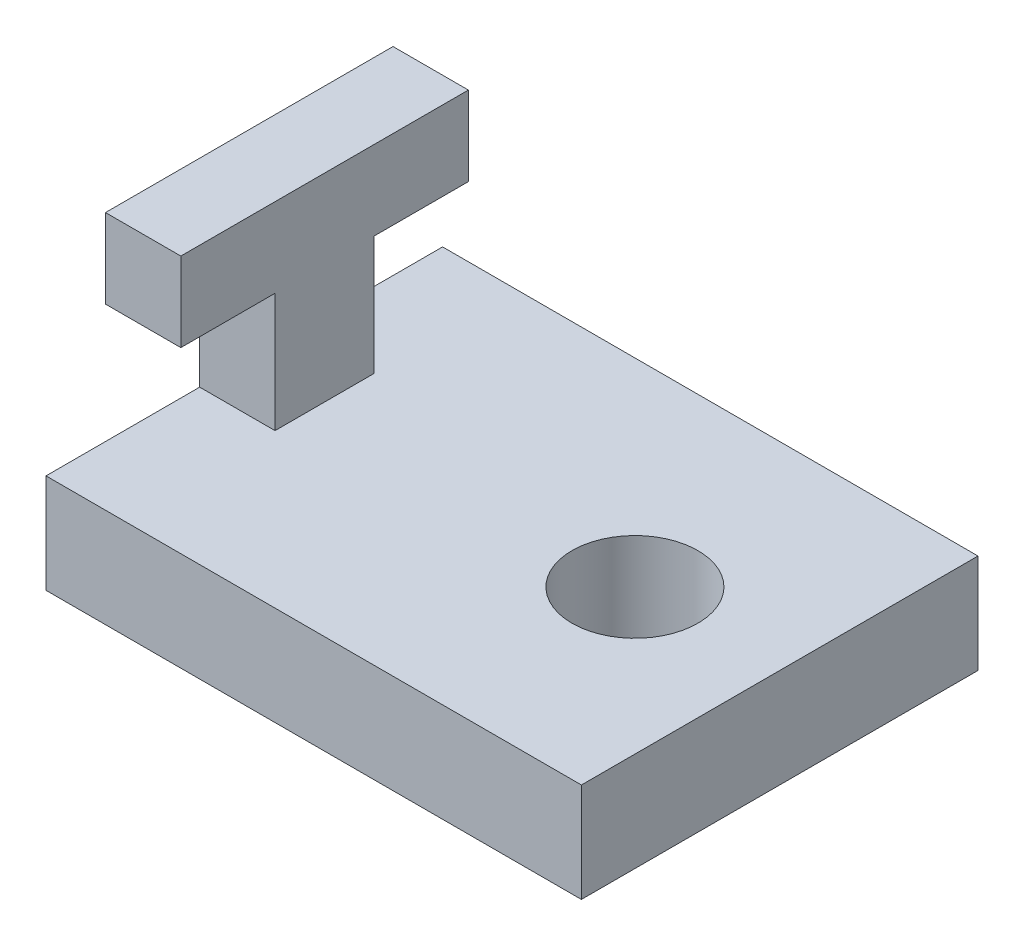
ISO-10303-21;
HEADER;
FILE_DESCRIPTION(('STEP AP214'),'2;1');
FILE_NAME('part.step','',(''),(''),'','','');
FILE_SCHEMA(('AUTOMOTIVE_DESIGN { 1 0 10303 214 1 1 1 1 }'));
ENDSEC;
DATA;
#1=APPLICATION_CONTEXT('core data for automotive mechanical design processes');
#2=APPLICATION_PROTOCOL_DEFINITION('international standard','automotive_design',2000,#1);
#3=PRODUCT_CONTEXT('',#1,'mechanical');
#4=PRODUCT('Part','Part','',(#3));
#5=PRODUCT_RELATED_PRODUCT_CATEGORY('part','',(#4));
#6=PRODUCT_DEFINITION_FORMATION('','',#4);
#7=PRODUCT_DEFINITION_CONTEXT('part definition',#1,'design');
#8=PRODUCT_DEFINITION('design','',#6,#7);
#9=PRODUCT_DEFINITION_SHAPE('','',#8);
#10=(LENGTH_UNIT() NAMED_UNIT(*) SI_UNIT(.MILLI.,.METRE.));
#11=(NAMED_UNIT(*) PLANE_ANGLE_UNIT() SI_UNIT($,.RADIAN.));
#12=(NAMED_UNIT(*) SI_UNIT($,.STERADIAN.) SOLID_ANGLE_UNIT());
#13=UNCERTAINTY_MEASURE_WITH_UNIT(LENGTH_MEASURE(1.E-05),#10,'distance_accuracy_value','');
#14=(GEOMETRIC_REPRESENTATION_CONTEXT(3) GLOBAL_UNCERTAINTY_ASSIGNED_CONTEXT((#13)) GLOBAL_UNIT_ASSIGNED_CONTEXT((#10,
#11,#12)) REPRESENTATION_CONTEXT('',''));
#15=CARTESIAN_POINT('',(0.,0.,0.));
#16=DIRECTION('',(0.,0.,1.));
#17=DIRECTION('',(1.,0.,0.));
#18=AXIS2_PLACEMENT_3D('',#15,#16,#17);
#19=CARTESIAN_POINT('',(96.52,381.,-323.85));
#20=DIRECTION('',(0.,0.,1.));
#21=DIRECTION('',(1.,0.,0.));
#22=AXIS2_PLACEMENT_3D('',#19,#20,#21);
#23=PLANE('',#22);
#24=DIRECTION('',(-1.,0.,0.));
#25=VECTOR('',#24,1.);
#26=CARTESIAN_POINT('',(96.52,279.4,-323.85));
#27=LINE('',#26,#25);
#28=CARTESIAN_POINT('',(96.52,279.4,-323.85));
#29=VERTEX_POINT('',#28);
#30=CARTESIAN_POINT('',(0.,279.4,-323.85));
#31=VERTEX_POINT('',#30);
#32=EDGE_CURVE('E153',#29,#31,#27,.T.);
#33=ORIENTED_EDGE('',*,*,#32,.F.);
#34=DIRECTION('',(0.,-1.,0.));
#35=VECTOR('',#34,1.);
#36=CARTESIAN_POINT('',(96.52,381.,-323.85));
#37=LINE('',#36,#35);
#38=CARTESIAN_POINT('',(96.52,127.,-323.85));
#39=VERTEX_POINT('',#38);
#40=EDGE_CURVE('E157',#29,#39,#37,.T.);
#41=ORIENTED_EDGE('',*,*,#40,.T.);
#42=DIRECTION('',(-1.,0.,0.));
#43=VECTOR('',#42,1.);
#44=CARTESIAN_POINT('',(96.52,127.,-323.85));
#45=LINE('',#44,#43);
#46=CARTESIAN_POINT('',(0.,127.,-323.85));
#47=VERTEX_POINT('',#46);
#48=EDGE_CURVE('E193',#39,#47,#45,.T.);
#49=ORIENTED_EDGE('',*,*,#48,.T.);
#50=DIRECTION('',(0.,-1.,0.));
#51=VECTOR('',#50,1.);
#52=CARTESIAN_POINT('',(0.,381.,-323.85));
#53=LINE('',#52,#51);
#54=EDGE_CURVE('E206',#31,#47,#53,.T.);
#55=ORIENTED_EDGE('',*,*,#54,.F.);
#56=EDGE_LOOP('',(#33,#41,#49,#55));
#57=FACE_BOUND('',#56,.T.);
#58=ADVANCED_FACE('F39',(#57),#23,.F.);
#59=CARTESIAN_POINT('',(-1.35129474703731E-13,381.,-196.85));
#60=DIRECTION('',(0.,0.,-1.));
#61=DIRECTION('',(-1.,0.,0.));
#62=AXIS2_PLACEMENT_3D('',#59,#60,#61);
#63=PLANE('',#62);
#64=DIRECTION('',(1.,0.,0.));
#65=VECTOR('',#64,1.);
#66=CARTESIAN_POINT('',(0.,279.4,-196.85));
#67=LINE('',#66,#65);
#68=CARTESIAN_POINT('',(0.,279.4,-196.85));
#69=VERTEX_POINT('',#68);
#70=CARTESIAN_POINT('',(96.52,279.4,-196.85));
#71=VERTEX_POINT('',#70);
#72=EDGE_CURVE('E159',#69,#71,#67,.T.);
#73=ORIENTED_EDGE('',*,*,#72,.F.);
#74=DIRECTION('',(0.,-1.,0.));
#75=VECTOR('',#74,1.);
#76=CARTESIAN_POINT('',(-1.35129474703731E-13,381.,-196.85));
#77=LINE('',#76,#75);
#78=CARTESIAN_POINT('',(0.,127.,-196.85));
#79=VERTEX_POINT('',#78);
#80=EDGE_CURVE('E63',#69,#79,#77,.T.);
#81=ORIENTED_EDGE('',*,*,#80,.T.);
#82=DIRECTION('',(1.,0.,0.));
#83=VECTOR('',#82,1.);
#84=CARTESIAN_POINT('',(-1.35129474703731E-13,127.,-196.85));
#85=LINE('',#84,#83);
#86=CARTESIAN_POINT('',(96.52,127.,-196.85));
#87=VERTEX_POINT('',#86);
#88=EDGE_CURVE('E188',#79,#87,#85,.T.);
#89=ORIENTED_EDGE('',*,*,#88,.T.);
#90=DIRECTION('',(0.,-1.,0.));
#91=VECTOR('',#90,1.);
#92=CARTESIAN_POINT('',(96.52,381.,-196.85));
#93=LINE('',#92,#91);
#94=EDGE_CURVE('E55',#71,#87,#93,.T.);
#95=ORIENTED_EDGE('',*,*,#94,.F.);
#96=EDGE_LOOP('',(#73,#81,#89,#95));
#97=FACE_BOUND('',#96,.T.);
#98=ADVANCED_FACE('F291',(#97),#63,.F.);
#99=CARTESIAN_POINT('',(0.,127.,0.));
#100=DIRECTION('',(0.,-1.,0.));
#101=DIRECTION('',(0.,0.,-1.));
#102=AXIS2_PLACEMENT_3D('',#99,#100,#101);
#103=PLANE('',#102);
#104=CARTESIAN_POINT('',(500.38,127.,-254.));
#105=DIRECTION('',(0.,1.,0.));
#106=DIRECTION('',(0.,0.,1.));
#107=AXIS2_PLACEMENT_3D('',#104,#105,#106);
#108=CIRCLE('',#107,80.645);
#109=CARTESIAN_POINT('',(500.38,127.,-173.355));
#110=VERTEX_POINT('',#109);
#111=EDGE_CURVE('E277',#110,#110,#108,.T.);
#112=ORIENTED_EDGE('',*,*,#111,.F.);
#113=EDGE_LOOP('',(#112));
#114=FACE_BOUND('',#113,.T.);
#115=ORIENTED_EDGE('',*,*,#88,.F.);
#116=DIRECTION('',(0.,0.,1.));
#117=VECTOR('',#116,1.);
#118=CARTESIAN_POINT('',(0.,127.,0.));
#119=LINE('',#118,#117);
#120=CARTESIAN_POINT('',(0.,127.,0.));
#121=VERTEX_POINT('',#120);
#122=EDGE_CURVE('E219',#79,#121,#119,.T.);
#123=ORIENTED_EDGE('',*,*,#122,.T.);
#124=DIRECTION('',(1.,0.,0.));
#125=VECTOR('',#124,1.);
#126=CARTESIAN_POINT('',(0.,127.,0.));
#127=LINE('',#126,#125);
#128=CARTESIAN_POINT('',(685.8,127.,0.));
#129=VERTEX_POINT('',#128);
#130=EDGE_CURVE('E218',#121,#129,#127,.T.);
#131=ORIENTED_EDGE('',*,*,#130,.T.);
#132=DIRECTION('',(0.,0.,-1.));
#133=VECTOR('',#132,1.);
#134=CARTESIAN_POINT('',(685.8,127.,0.));
#135=LINE('',#134,#133);
#136=CARTESIAN_POINT('',(685.8,127.,-508.));
#137=VERTEX_POINT('',#136);
#138=EDGE_CURVE('E222',#129,#137,#135,.T.);
#139=ORIENTED_EDGE('',*,*,#138,.T.);
#140=DIRECTION('',(-1.,0.,0.));
#141=VECTOR('',#140,1.);
#142=CARTESIAN_POINT('',(-1.11022302462516E-13,127.,-508.));
#143=LINE('',#142,#141);
#144=CARTESIAN_POINT('',(-1.11022302462516E-13,127.,-508.));
#145=VERTEX_POINT('',#144);
#146=EDGE_CURVE('E225',#137,#145,#143,.T.);
#147=ORIENTED_EDGE('',*,*,#146,.T.);
#148=EDGE_CURVE('E214',#145,#47,#119,.T.);
#149=ORIENTED_EDGE('',*,*,#148,.T.);
#150=ORIENTED_EDGE('',*,*,#48,.F.);
#151=DIRECTION('',(0.,0.,-1.));
#152=VECTOR('',#151,1.);
#153=CARTESIAN_POINT('',(96.52,127.,-323.85));
#154=LINE('',#153,#152);
#155=EDGE_CURVE('E198',#87,#39,#154,.T.);
#156=ORIENTED_EDGE('',*,*,#155,.F.);
#157=EDGE_LOOP('',(#115,#123,#131,#139,#147,#149,#150,#156));
#158=FACE_BOUND('',#157,.T.);
#159=ADVANCED_FACE('F271',(#114,#158),#103,.F.);
#160=CARTESIAN_POINT('',(0.,127.,0.));
#161=DIRECTION('',(1.,0.,0.));
#162=DIRECTION('',(0.,0.,-1.));
#163=AXIS2_PLACEMENT_3D('',#160,#161,#162);
#164=PLANE('',#163);
#165=DIRECTION('',(0.,0.,1.));
#166=VECTOR('',#165,1.);
#167=CARTESIAN_POINT('',(0.,0.,0.));
#168=LINE('',#167,#166);
#169=CARTESIAN_POINT('',(-1.11022302462516E-13,0.,-508.));
#170=VERTEX_POINT('',#169);
#171=CARTESIAN_POINT('',(0.,0.,0.));
#172=VERTEX_POINT('',#171);
#173=EDGE_CURVE('E213',#170,#172,#168,.T.);
#174=ORIENTED_EDGE('',*,*,#173,.T.);
#175=DIRECTION('',(0.,-1.,0.));
#176=VECTOR('',#175,1.);
#177=CARTESIAN_POINT('',(0.,127.,0.));
#178=LINE('',#177,#176);
#179=EDGE_CURVE('E11',#121,#172,#178,.T.);
#180=ORIENTED_EDGE('',*,*,#179,.F.);
#181=ORIENTED_EDGE('',*,*,#122,.F.);
#182=ORIENTED_EDGE('',*,*,#80,.F.);
#183=DIRECTION('',(0.,0.,-1.));
#184=VECTOR('',#183,1.);
#185=CARTESIAN_POINT('',(0.,279.4,-76.2));
#186=LINE('',#185,#184);
#187=CARTESIAN_POINT('',(0.,279.4,-76.2));
#188=VERTEX_POINT('',#187);
#189=EDGE_CURVE('E185',#188,#69,#186,.T.);
#190=ORIENTED_EDGE('',*,*,#189,.F.);
#191=DIRECTION('',(0.,-1.,0.));
#192=VECTOR('',#191,1.);
#193=CARTESIAN_POINT('',(-1.35129474703731E-13,381.,-76.2));
#194=LINE('',#193,#192);
#195=CARTESIAN_POINT('',(-1.35129474703731E-13,381.,-76.2));
#196=VERTEX_POINT('',#195);
#197=EDGE_CURVE('E163',#196,#188,#194,.T.);
#198=ORIENTED_EDGE('',*,*,#197,.F.);
#199=DIRECTION('',(0.,0.,1.));
#200=VECTOR('',#199,1.);
#201=CARTESIAN_POINT('',(0.,381.,-323.85));
#202=LINE('',#201,#200);
#203=CARTESIAN_POINT('',(0.,381.,-444.5));
#204=VERTEX_POINT('',#203);
#205=EDGE_CURVE('E192',#204,#196,#202,.T.);
#206=ORIENTED_EDGE('',*,*,#205,.F.);
#207=DIRECTION('',(0.,1.,0.));
#208=VECTOR('',#207,1.);
#209=CARTESIAN_POINT('',(0.,381.,-444.5));
#210=LINE('',#209,#208);
#211=CARTESIAN_POINT('',(0.,279.4,-444.5));
#212=VERTEX_POINT('',#211);
#213=EDGE_CURVE('E144',#212,#204,#210,.T.);
#214=ORIENTED_EDGE('',*,*,#213,.F.);
#215=DIRECTION('',(0.,0.,1.));
#216=VECTOR('',#215,1.);
#217=CARTESIAN_POINT('',(0.,279.4,-444.5));
#218=LINE('',#217,#216);
#219=EDGE_CURVE('E139',#212,#31,#218,.T.);
#220=ORIENTED_EDGE('',*,*,#219,.T.);
#221=ORIENTED_EDGE('',*,*,#54,.T.);
#222=ORIENTED_EDGE('',*,*,#148,.F.);
#223=DIRECTION('',(0.,-1.,0.));
#224=VECTOR('',#223,1.);
#225=CARTESIAN_POINT('',(-1.11022302462516E-13,127.,-508.));
#226=LINE('',#225,#224);
#227=EDGE_CURVE('E228',#145,#170,#226,.T.);
#228=ORIENTED_EDGE('',*,*,#227,.T.);
#229=EDGE_LOOP('',(#174,#180,#181,#182,#190,#198,#206,#214,#220,#221,#222,#228));
#230=FACE_BOUND('',#229,.T.);
#231=ADVANCED_FACE('F41',(#230),#164,.F.);
#232=CARTESIAN_POINT('',(0.,127.,0.));
#233=DIRECTION('',(0.,0.,-1.));
#234=DIRECTION('',(-1.,0.,0.));
#235=AXIS2_PLACEMENT_3D('',#232,#233,#234);
#236=PLANE('',#235);
#237=DIRECTION('',(1.,0.,0.));
#238=VECTOR('',#237,1.);
#239=CARTESIAN_POINT('',(0.,0.,0.));
#240=LINE('',#239,#238);
#241=CARTESIAN_POINT('',(685.8,0.,0.));
#242=VERTEX_POINT('',#241);
#243=EDGE_CURVE('E232',#172,#242,#240,.T.);
#244=ORIENTED_EDGE('',*,*,#243,.T.);
#245=DIRECTION('',(0.,-1.,0.));
#246=VECTOR('',#245,1.);
#247=CARTESIAN_POINT('',(685.8,127.,0.));
#248=LINE('',#247,#246);
#249=EDGE_CURVE('E48',#129,#242,#248,.T.);
#250=ORIENTED_EDGE('',*,*,#249,.F.);
#251=ORIENTED_EDGE('',*,*,#130,.F.);
#252=ORIENTED_EDGE('',*,*,#179,.T.);
#253=EDGE_LOOP('',(#244,#250,#251,#252));
#254=FACE_BOUND('',#253,.T.);
#255=ADVANCED_FACE('F297',(#254),#236,.F.);
#256=CARTESIAN_POINT('',(685.8,127.,0.));
#257=DIRECTION('',(-1.,0.,0.));
#258=DIRECTION('',(0.,0.,1.));
#259=AXIS2_PLACEMENT_3D('',#256,#257,#258);
#260=PLANE('',#259);
#261=DIRECTION('',(0.,0.,-1.));
#262=VECTOR('',#261,1.);
#263=CARTESIAN_POINT('',(685.8,0.,0.));
#264=LINE('',#263,#262);
#265=CARTESIAN_POINT('',(685.8,0.,-508.));
#266=VERTEX_POINT('',#265);
#267=EDGE_CURVE('E235',#242,#266,#264,.T.);
#268=ORIENTED_EDGE('',*,*,#267,.T.);
#269=DIRECTION('',(0.,-1.,0.));
#270=VECTOR('',#269,1.);
#271=CARTESIAN_POINT('',(685.8,127.,-508.));
#272=LINE('',#271,#270);
#273=EDGE_CURVE('E244',#137,#266,#272,.T.);
#274=ORIENTED_EDGE('',*,*,#273,.F.);
#275=ORIENTED_EDGE('',*,*,#138,.F.);
#276=ORIENTED_EDGE('',*,*,#249,.T.);
#277=EDGE_LOOP('',(#268,#274,#275,#276));
#278=FACE_BOUND('',#277,.T.);
#279=ADVANCED_FACE('F253',(#278),#260,.F.);
#280=CARTESIAN_POINT('',(-1.11022302462516E-13,127.,-508.));
#281=DIRECTION('',(0.,0.,1.));
#282=DIRECTION('',(1.,0.,0.));
#283=AXIS2_PLACEMENT_3D('',#280,#281,#282);
#284=PLANE('',#283);
#285=DIRECTION('',(-1.,0.,0.));
#286=VECTOR('',#285,1.);
#287=CARTESIAN_POINT('',(-1.11022302462516E-13,0.,-508.));
#288=LINE('',#287,#286);
#289=EDGE_CURVE('E238',#266,#170,#288,.T.);
#290=ORIENTED_EDGE('',*,*,#289,.T.);
#291=ORIENTED_EDGE('',*,*,#227,.F.);
#292=ORIENTED_EDGE('',*,*,#146,.F.);
#293=ORIENTED_EDGE('',*,*,#273,.T.);
#294=EDGE_LOOP('',(#290,#291,#292,#293));
#295=FACE_BOUND('',#294,.T.);
#296=ADVANCED_FACE('F263',(#295),#284,.F.);
#297=CARTESIAN_POINT('',(0.,0.,0.));
#298=DIRECTION('',(0.,-1.,0.));
#299=DIRECTION('',(0.,0.,-1.));
#300=AXIS2_PLACEMENT_3D('',#297,#298,#299);
#301=PLANE('',#300);
#302=CARTESIAN_POINT('',(500.38,0.,-254.));
#303=DIRECTION('',(0.,1.,0.));
#304=DIRECTION('',(0.,0.,1.));
#305=AXIS2_PLACEMENT_3D('',#302,#303,#304);
#306=CIRCLE('',#305,80.645);
#307=CARTESIAN_POINT('',(500.38,0.,-173.355));
#308=VERTEX_POINT('',#307);
#309=EDGE_CURVE('E274',#308,#308,#306,.T.);
#310=ORIENTED_EDGE('',*,*,#309,.T.);
#311=EDGE_LOOP('',(#310));
#312=FACE_BOUND('',#311,.T.);
#313=ORIENTED_EDGE('',*,*,#173,.F.);
#314=ORIENTED_EDGE('',*,*,#289,.F.);
#315=ORIENTED_EDGE('',*,*,#267,.F.);
#316=ORIENTED_EDGE('',*,*,#243,.F.);
#317=EDGE_LOOP('',(#313,#314,#315,#316));
#318=FACE_BOUND('',#317,.T.);
#319=ADVANCED_FACE('F260',(#312,#318),#301,.T.);
#320=CARTESIAN_POINT('',(96.52,381.,-323.85));
#321=DIRECTION('',(-1.,0.,0.));
#322=DIRECTION('',(0.,0.,1.));
#323=AXIS2_PLACEMENT_3D('',#320,#321,#322);
#324=PLANE('',#323);
#325=ORIENTED_EDGE('',*,*,#155,.T.);
#326=ORIENTED_EDGE('',*,*,#40,.F.);
#327=DIRECTION('',(0.,0.,1.));
#328=VECTOR('',#327,1.);
#329=CARTESIAN_POINT('',(96.52,279.4,-444.5));
#330=LINE('',#329,#328);
#331=CARTESIAN_POINT('',(96.52,279.4,-444.5));
#332=VERTEX_POINT('',#331);
#333=EDGE_CURVE('E136',#332,#29,#330,.T.);
#334=ORIENTED_EDGE('',*,*,#333,.F.);
#335=DIRECTION('',(0.,-1.,0.));
#336=VECTOR('',#335,1.);
#337=CARTESIAN_POINT('',(96.52,381.,-444.5));
#338=LINE('',#337,#336);
#339=CARTESIAN_POINT('',(96.52,381.,-444.5));
#340=VERTEX_POINT('',#339);
#341=EDGE_CURVE('E145',#340,#332,#338,.T.);
#342=ORIENTED_EDGE('',*,*,#341,.F.);
#343=DIRECTION('',(0.,0.,-1.));
#344=VECTOR('',#343,1.);
#345=CARTESIAN_POINT('',(96.52,381.,-323.85));
#346=LINE('',#345,#344);
#347=CARTESIAN_POINT('',(96.52,381.,-76.2));
#348=VERTEX_POINT('',#347);
#349=EDGE_CURVE('E189',#348,#340,#346,.T.);
#350=ORIENTED_EDGE('',*,*,#349,.F.);
#351=DIRECTION('',(0.,1.,0.));
#352=VECTOR('',#351,1.);
#353=CARTESIAN_POINT('',(96.52,381.,-76.2));
#354=LINE('',#353,#352);
#355=CARTESIAN_POINT('',(96.52,279.4,-76.2));
#356=VERTEX_POINT('',#355);
#357=EDGE_CURVE('E174',#356,#348,#354,.T.);
#358=ORIENTED_EDGE('',*,*,#357,.F.);
#359=DIRECTION('',(0.,0.,-1.));
#360=VECTOR('',#359,1.);
#361=CARTESIAN_POINT('',(96.52,279.4,-76.2));
#362=LINE('',#361,#360);
#363=EDGE_CURVE('E181',#356,#71,#362,.T.);
#364=ORIENTED_EDGE('',*,*,#363,.T.);
#365=ORIENTED_EDGE('',*,*,#94,.T.);
#366=EDGE_LOOP('',(#325,#326,#334,#342,#350,#358,#364,#365));
#367=FACE_BOUND('',#366,.T.);
#368=ADVANCED_FACE('F156',(#367),#324,.F.);
#369=CARTESIAN_POINT('',(0.,381.,0.));
#370=DIRECTION('',(0.,-1.,0.));
#371=DIRECTION('',(0.,0.,-1.));
#372=AXIS2_PLACEMENT_3D('',#369,#370,#371);
#373=PLANE('',#372);
#374=ORIENTED_EDGE('',*,*,#205,.T.);
#375=DIRECTION('',(-1.,0.,0.));
#376=VECTOR('',#375,1.);
#377=CARTESIAN_POINT('',(-1.35129474703731E-13,381.,-76.2));
#378=LINE('',#377,#376);
#379=EDGE_CURVE('E178',#348,#196,#378,.T.);
#380=ORIENTED_EDGE('',*,*,#379,.F.);
#381=ORIENTED_EDGE('',*,*,#349,.T.);
#382=DIRECTION('',(1.,0.,0.));
#383=VECTOR('',#382,1.);
#384=CARTESIAN_POINT('',(96.52,381.,-444.5));
#385=LINE('',#384,#383);
#386=EDGE_CURVE('E151',#204,#340,#385,.T.);
#387=ORIENTED_EDGE('',*,*,#386,.F.);
#388=EDGE_LOOP('',(#374,#380,#381,#387));
#389=FACE_BOUND('',#388,.T.);
#390=ADVANCED_FACE('F306',(#389),#373,.F.);
#391=CARTESIAN_POINT('',(0.,279.4,-76.2));
#392=DIRECTION('',(0.,1.,0.));
#393=DIRECTION('',(0.,0.,1.));
#394=AXIS2_PLACEMENT_3D('',#391,#392,#393);
#395=PLANE('',#394);
#396=ORIENTED_EDGE('',*,*,#72,.T.);
#397=ORIENTED_EDGE('',*,*,#363,.F.);
#398=DIRECTION('',(1.,0.,0.));
#399=VECTOR('',#398,1.);
#400=CARTESIAN_POINT('',(0.,279.4,-76.2));
#401=LINE('',#400,#399);
#402=EDGE_CURVE('E171',#188,#356,#401,.T.);
#403=ORIENTED_EDGE('',*,*,#402,.F.);
#404=ORIENTED_EDGE('',*,*,#189,.T.);
#405=EDGE_LOOP('',(#396,#397,#403,#404));
#406=FACE_BOUND('',#405,.T.);
#407=ADVANCED_FACE('F313',(#406),#395,.F.);
#408=CARTESIAN_POINT('',(0.,0.,-76.2));
#409=DIRECTION('',(0.,0.,1.));
#410=DIRECTION('',(1.,0.,0.));
#411=AXIS2_PLACEMENT_3D('',#408,#409,#410);
#412=PLANE('',#411);
#413=ORIENTED_EDGE('',*,*,#197,.T.);
#414=ORIENTED_EDGE('',*,*,#402,.T.);
#415=ORIENTED_EDGE('',*,*,#357,.T.);
#416=ORIENTED_EDGE('',*,*,#379,.T.);
#417=EDGE_LOOP('',(#413,#414,#415,#416));
#418=FACE_BOUND('',#417,.T.);
#419=ADVANCED_FACE('F333',(#418),#412,.T.);
#420=CARTESIAN_POINT('',(96.52,279.4,-444.5));
#421=DIRECTION('',(0.,1.,0.));
#422=DIRECTION('',(0.,0.,1.));
#423=AXIS2_PLACEMENT_3D('',#420,#421,#422);
#424=PLANE('',#423);
#425=ORIENTED_EDGE('',*,*,#32,.T.);
#426=ORIENTED_EDGE('',*,*,#219,.F.);
#427=DIRECTION('',(-1.,0.,0.));
#428=VECTOR('',#427,1.);
#429=CARTESIAN_POINT('',(96.52,279.4,-444.5));
#430=LINE('',#429,#428);
#431=EDGE_CURVE('E132',#332,#212,#430,.T.);
#432=ORIENTED_EDGE('',*,*,#431,.F.);
#433=ORIENTED_EDGE('',*,*,#333,.T.);
#434=EDGE_LOOP('',(#425,#426,#432,#433));
#435=FACE_BOUND('',#434,.T.);
#436=ADVANCED_FACE('F134',(#435),#424,.F.);
#437=CARTESIAN_POINT('',(0.,0.,-444.5));
#438=DIRECTION('',(0.,0.,-1.));
#439=DIRECTION('',(-1.,0.,0.));
#440=AXIS2_PLACEMENT_3D('',#437,#438,#439);
#441=PLANE('',#440);
#442=ORIENTED_EDGE('',*,*,#341,.T.);
#443=ORIENTED_EDGE('',*,*,#431,.T.);
#444=ORIENTED_EDGE('',*,*,#213,.T.);
#445=ORIENTED_EDGE('',*,*,#386,.T.);
#446=EDGE_LOOP('',(#442,#443,#444,#445));
#447=FACE_BOUND('',#446,.T.);
#448=ADVANCED_FACE('F149',(#447),#441,.T.);
#449=CARTESIAN_POINT('',(500.38,0.,-254.));
#450=DIRECTION('',(0.,1.,0.));
#451=DIRECTION('',(0.,0.,1.));
#452=AXIS2_PLACEMENT_3D('',#449,#450,#451);
#453=CYLINDRICAL_SURFACE('',#452,80.645);
#454=ORIENTED_EDGE('',*,*,#309,.F.);
#455=EDGE_LOOP('',(#454));
#456=FACE_BOUND('',#455,.T.);
#457=ORIENTED_EDGE('',*,*,#111,.T.);
#458=EDGE_LOOP('',(#457));
#459=FACE_BOUND('',#458,.T.);
#460=ADVANCED_FACE('F288',(#456,#459),#453,.F.);
#461=CLOSED_SHELL('',(#58,#98,#159,#231,#255,#279,#296,#319,#368,#390,#407,#419,#436,#448,#460));
#462=MANIFOLD_SOLID_BREP('B2',#461);
#463=ADVANCED_BREP_SHAPE_REPRESENTATION('',(#18,#462),#14);
#464=SHAPE_DEFINITION_REPRESENTATION(#9,#463);
ENDSEC;
END-ISO-10303-21;
